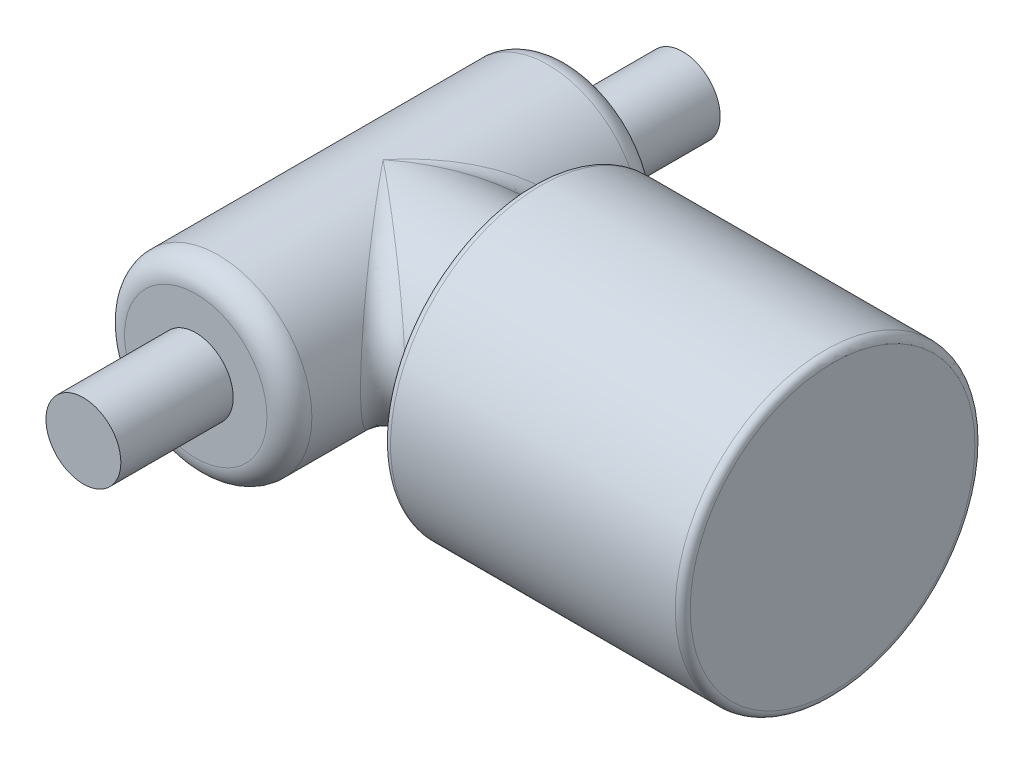
ISO-10303-21;
HEADER;
FILE_DESCRIPTION(('STEP AP214'),'2;1');
FILE_NAME('part.step','',(''),(''),'','','');
FILE_SCHEMA(('AUTOMOTIVE_DESIGN { 1 0 10303 214 1 1 1 1 }'));
ENDSEC;
DATA;
#1=APPLICATION_CONTEXT('core data for automotive mechanical design processes');
#2=APPLICATION_PROTOCOL_DEFINITION('international standard','automotive_design',2000,#1);
#3=PRODUCT_CONTEXT('',#1,'mechanical');
#4=PRODUCT('Part','Part','',(#3));
#5=PRODUCT_RELATED_PRODUCT_CATEGORY('part','',(#4));
#6=PRODUCT_DEFINITION_FORMATION('','',#4);
#7=PRODUCT_DEFINITION_CONTEXT('part definition',#1,'design');
#8=PRODUCT_DEFINITION('design','',#6,#7);
#9=PRODUCT_DEFINITION_SHAPE('','',#8);
#10=(LENGTH_UNIT() NAMED_UNIT(*) SI_UNIT(.MILLI.,.METRE.));
#11=(NAMED_UNIT(*) PLANE_ANGLE_UNIT() SI_UNIT($,.RADIAN.));
#12=(NAMED_UNIT(*) SI_UNIT($,.STERADIAN.) SOLID_ANGLE_UNIT());
#13=UNCERTAINTY_MEASURE_WITH_UNIT(LENGTH_MEASURE(1.E-05),#10,'distance_accuracy_value','');
#14=(GEOMETRIC_REPRESENTATION_CONTEXT(3) GLOBAL_UNCERTAINTY_ASSIGNED_CONTEXT((#13)) GLOBAL_UNIT_ASSIGNED_CONTEXT((#10,
#11,#12)) REPRESENTATION_CONTEXT('',''));
#15=CARTESIAN_POINT('',(0.,0.,0.));
#16=DIRECTION('',(0.,0.,1.));
#17=DIRECTION('',(1.,0.,0.));
#18=AXIS2_PLACEMENT_3D('',#15,#16,#17);
#19=CARTESIAN_POINT('',(55.3553390593274,0.,0.));
#20=DIRECTION('',(-1.,0.,0.));
#21=DIRECTION('',(0.,0.,1.));
#22=AXIS2_PLACEMENT_3D('',#19,#20,#21);
#23=CYLINDRICAL_SURFACE('',#22,12.5);
#24=CARTESIAN_POINT('',(20.,0.,0.));
#25=DIRECTION('',(1.,0.,0.));
#26=DIRECTION('',(0.,0.,-1.));
#27=AXIS2_PLACEMENT_3D('',#24,#25,#26);
#28=CIRCLE('',#27,12.5);
#29=CARTESIAN_POINT('',(20.,0.,-12.5));
#30=VERTEX_POINT('',#29);
#31=EDGE_CURVE('E78',#30,#30,#28,.F.);
#32=ORIENTED_EDGE('',*,*,#31,.T.);
#33=EDGE_LOOP('',(#32));
#34=FACE_BOUND('',#33,.T.);
#35=CARTESIAN_POINT('',(0.,0.,0.));
#36=DIRECTION('',(-0.627752451189782,0.,0.778413039475329));
#37=DIRECTION('',(-0.778413039475329,0.,-0.627752451189782));
#38=AXIS2_PLACEMENT_3D('',#35,#36,#37);
#39=ELLIPSE('',#38,19.9123077517399,12.5);
#40=CARTESIAN_POINT('',(0.,12.5,0.));
#41=VERTEX_POINT('',#40);
#42=CARTESIAN_POINT('',(0.,-12.5,0.));
#43=VERTEX_POINT('',#42);
#44=EDGE_CURVE('E66',#41,#43,#39,.F.);
#45=ORIENTED_EDGE('',*,*,#44,.T.);
#46=CARTESIAN_POINT('',(0.,0.,0.));
#47=DIRECTION('',(0.627752451189782,0.,0.778413039475329));
#48=DIRECTION('',(0.778413039475329,0.,-0.627752451189782));
#49=AXIS2_PLACEMENT_3D('',#46,#47,#48);
#50=ELLIPSE('',#49,19.9123077517399,12.5);
#51=EDGE_CURVE('E61',#43,#41,#50,.T.);
#52=ORIENTED_EDGE('',*,*,#51,.T.);
#53=EDGE_LOOP('',(#45,#52));
#54=FACE_BOUND('',#53,.T.);
#55=ADVANCED_FACE('F47',(#34,#54),#23,.T.);
#56=CARTESIAN_POINT('',(20.,0.,0.));
#57=DIRECTION('',(1.,0.,0.));
#58=DIRECTION('',(0.,0.,-1.));
#59=AXIS2_PLACEMENT_3D('',#56,#57,#58);
#60=CYLINDRICAL_SURFACE('',#59,20.);
#61=CARTESIAN_POINT('',(21.,0.,0.));
#62=DIRECTION('',(1.,0.,0.));
#63=DIRECTION('',(0.,0.,-1.));
#64=AXIS2_PLACEMENT_3D('',#61,#62,#63);
#65=CIRCLE('',#64,20.);
#66=CARTESIAN_POINT('',(21.,0.,-20.));
#67=VERTEX_POINT('',#66);
#68=EDGE_CURVE('E132',#67,#67,#65,.T.);
#69=ORIENTED_EDGE('',*,*,#68,.T.);
#70=EDGE_LOOP('',(#69));
#71=FACE_BOUND('',#70,.T.);
#72=CARTESIAN_POINT('',(59.,0.,0.));
#73=DIRECTION('',(1.,0.,0.));
#74=DIRECTION('',(0.,0.,-1.));
#75=AXIS2_PLACEMENT_3D('',#72,#73,#74);
#76=CIRCLE('',#75,20.);
#77=CARTESIAN_POINT('',(59.,0.,-20.));
#78=VERTEX_POINT('',#77);
#79=EDGE_CURVE('E133',#78,#78,#76,.F.);
#80=ORIENTED_EDGE('',*,*,#79,.T.);
#81=EDGE_LOOP('',(#80));
#82=FACE_BOUND('',#81,.T.);
#83=ADVANCED_FACE('F106',(#71,#82),#60,.T.);
#84=CARTESIAN_POINT('',(20.,0.,0.));
#85=DIRECTION('',(1.,0.,0.));
#86=DIRECTION('',(0.,0.,-1.));
#87=AXIS2_PLACEMENT_3D('',#84,#85,#86);
#88=PLANE('',#87);
#89=ORIENTED_EDGE('',*,*,#31,.F.);
#90=EDGE_LOOP('',(#89));
#91=FACE_BOUND('',#90,.T.);
#92=CARTESIAN_POINT('',(20.,0.,0.));
#93=DIRECTION('',(1.,0.,0.));
#94=DIRECTION('',(0.,0.,-1.));
#95=AXIS2_PLACEMENT_3D('',#92,#93,#94);
#96=CIRCLE('',#95,19.);
#97=CARTESIAN_POINT('',(20.,0.,-19.));
#98=VERTEX_POINT('',#97);
#99=EDGE_CURVE('E129',#98,#98,#96,.F.);
#100=ORIENTED_EDGE('',*,*,#99,.T.);
#101=EDGE_LOOP('',(#100));
#102=FACE_BOUND('',#101,.T.);
#103=ADVANCED_FACE('F108',(#91,#102),#88,.F.);
#104=CARTESIAN_POINT('',(60.,0.,0.));
#105=DIRECTION('',(1.,0.,0.));
#106=DIRECTION('',(0.,0.,-1.));
#107=AXIS2_PLACEMENT_3D('',#104,#105,#106);
#108=PLANE('',#107);
#109=CARTESIAN_POINT('',(60.,0.,0.));
#110=DIRECTION('',(1.,0.,0.));
#111=DIRECTION('',(0.,0.,-1.));
#112=AXIS2_PLACEMENT_3D('',#109,#110,#111);
#113=CIRCLE('',#112,19.);
#114=CARTESIAN_POINT('',(60.,0.,-19.));
#115=VERTEX_POINT('',#114);
#116=EDGE_CURVE('E135',#115,#115,#113,.T.);
#117=ORIENTED_EDGE('',*,*,#116,.T.);
#118=EDGE_LOOP('',(#117));
#119=FACE_BOUND('',#118,.T.);
#120=ADVANCED_FACE('F112',(#119),#108,.T.);
#121=CARTESIAN_POINT('',(21.,0.,0.));
#122=DIRECTION('',(1.,0.,0.));
#123=DIRECTION('',(0.,0.,-1.));
#124=AXIS2_PLACEMENT_3D('',#121,#122,#123);
#125=TOROIDAL_SURFACE('',#124,19.,1.);
#126=ORIENTED_EDGE('',*,*,#99,.F.);
#127=EDGE_LOOP('',(#126));
#128=FACE_BOUND('',#127,.T.);
#129=ORIENTED_EDGE('',*,*,#68,.F.);
#130=EDGE_LOOP('',(#129));
#131=FACE_BOUND('',#130,.T.);
#132=ADVANCED_FACE('F116',(#128,#131),#125,.T.);
#133=CARTESIAN_POINT('',(59.,0.,0.));
#134=DIRECTION('',(1.,0.,0.));
#135=DIRECTION('',(0.,0.,-1.));
#136=AXIS2_PLACEMENT_3D('',#133,#134,#135);
#137=TOROIDAL_SURFACE('',#136,19.,1.);
#138=ORIENTED_EDGE('',*,*,#79,.F.);
#139=EDGE_LOOP('',(#138));
#140=FACE_BOUND('',#139,.T.);
#141=ORIENTED_EDGE('',*,*,#116,.F.);
#142=EDGE_LOOP('',(#141));
#143=FACE_BOUND('',#142,.T.);
#144=ADVANCED_FACE('F97',(#140,#143),#137,.T.);
#145=CARTESIAN_POINT('',(0.,0.,25.));
#146=DIRECTION('',(0.,0.,-1.));
#147=DIRECTION('',(-1.,0.,0.));
#148=AXIS2_PLACEMENT_3D('',#145,#146,#147);
#149=CYLINDRICAL_SURFACE('',#148,12.5);
#150=CARTESIAN_POINT('',(0.,0.,-22.));
#151=DIRECTION('',(0.,0.,1.));
#152=DIRECTION('',(1.,0.,0.));
#153=AXIS2_PLACEMENT_3D('',#150,#151,#152);
#154=CIRCLE('',#153,12.5);
#155=CARTESIAN_POINT('',(12.5,0.,-22.));
#156=VERTEX_POINT('',#155);
#157=EDGE_CURVE('E187',#156,#156,#154,.T.);
#158=ORIENTED_EDGE('',*,*,#157,.T.);
#159=EDGE_LOOP('',(#158));
#160=FACE_BOUND('',#159,.T.);
#161=CARTESIAN_POINT('',(0.,0.,22.));
#162=DIRECTION('',(0.,0.,1.));
#163=DIRECTION('',(1.,0.,0.));
#164=AXIS2_PLACEMENT_3D('',#161,#162,#163);
#165=CIRCLE('',#164,12.5);
#166=CARTESIAN_POINT('',(12.5,0.,22.));
#167=VERTEX_POINT('',#166);
#168=EDGE_CURVE('E74',#167,#167,#165,.F.);
#169=ORIENTED_EDGE('',*,*,#168,.T.);
#170=EDGE_LOOP('',(#169));
#171=FACE_BOUND('',#170,.T.);
#172=CARTESIAN_POINT('',(0.,0.,0.));
#173=DIRECTION('',(-0.778413039475329,0.,0.627752451189782));
#174=DIRECTION('',(-0.627752451189782,0.,-0.778413039475329));
#175=AXIS2_PLACEMENT_3D('',#172,#173,#174);
#176=ELLIPSE('',#175,19.9123077517399,12.5);
#177=EDGE_CURVE('E69',#43,#41,#176,.T.);
#178=ORIENTED_EDGE('',*,*,#177,.T.);
#179=CARTESIAN_POINT('',(0.,0.,0.));
#180=DIRECTION('',(0.778413039475329,0.,0.627752451189782));
#181=DIRECTION('',(0.627752451189782,0.,-0.778413039475329));
#182=AXIS2_PLACEMENT_3D('',#179,#180,#181);
#183=ELLIPSE('',#182,19.9123077517399,12.5);
#184=EDGE_CURVE('E72',#41,#43,#183,.F.);
#185=ORIENTED_EDGE('',*,*,#184,.T.);
#186=EDGE_LOOP('',(#178,#185));
#187=FACE_BOUND('',#186,.T.);
#188=ADVANCED_FACE('F77',(#160,#171,#187),#149,.T.);
#189=CARTESIAN_POINT('',(0.,0.,25.));
#190=DIRECTION('',(0.,0.,1.));
#191=DIRECTION('',(1.,0.,0.));
#192=AXIS2_PLACEMENT_3D('',#189,#190,#191);
#193=PLANE('',#192);
#194=CARTESIAN_POINT('',(0.,0.,25.));
#195=DIRECTION('',(0.,0.,1.));
#196=DIRECTION('',(1.,0.,0.));
#197=AXIS2_PLACEMENT_3D('',#194,#195,#196);
#198=CIRCLE('',#197,5.);
#199=CARTESIAN_POINT('',(5.,0.,25.));
#200=VERTEX_POINT('',#199);
#201=EDGE_CURVE('E138',#200,#200,#198,.F.);
#202=ORIENTED_EDGE('',*,*,#201,.T.);
#203=EDGE_LOOP('',(#202));
#204=FACE_BOUND('',#203,.T.);
#205=CARTESIAN_POINT('',(0.,0.,25.));
#206=DIRECTION('',(0.,0.,1.));
#207=DIRECTION('',(1.,0.,0.));
#208=AXIS2_PLACEMENT_3D('',#205,#206,#207);
#209=CIRCLE('',#208,9.5);
#210=CARTESIAN_POINT('',(9.5,0.,25.));
#211=VERTEX_POINT('',#210);
#212=EDGE_CURVE('E55',#211,#211,#209,.T.);
#213=ORIENTED_EDGE('',*,*,#212,.T.);
#214=EDGE_LOOP('',(#213));
#215=FACE_BOUND('',#214,.T.);
#216=ADVANCED_FACE('F174',(#204,#215),#193,.T.);
#217=CARTESIAN_POINT('',(0.,0.,-25.));
#218=DIRECTION('',(0.,0.,1.));
#219=DIRECTION('',(1.,0.,0.));
#220=AXIS2_PLACEMENT_3D('',#217,#218,#219);
#221=PLANE('',#220);
#222=CARTESIAN_POINT('',(0.,0.,-25.));
#223=DIRECTION('',(0.,0.,1.));
#224=DIRECTION('',(1.,0.,0.));
#225=AXIS2_PLACEMENT_3D('',#222,#223,#224);
#226=CIRCLE('',#225,5.);
#227=CARTESIAN_POINT('',(5.,0.,-25.));
#228=VERTEX_POINT('',#227);
#229=EDGE_CURVE('E11',#228,#228,#226,.F.);
#230=ORIENTED_EDGE('',*,*,#229,.F.);
#231=EDGE_LOOP('',(#230));
#232=FACE_BOUND('',#231,.T.);
#233=CARTESIAN_POINT('',(0.,0.,-25.));
#234=DIRECTION('',(0.,0.,1.));
#235=DIRECTION('',(1.,0.,0.));
#236=AXIS2_PLACEMENT_3D('',#233,#234,#235);
#237=CIRCLE('',#236,9.5);
#238=CARTESIAN_POINT('',(9.5,0.,-25.));
#239=VERTEX_POINT('',#238);
#240=EDGE_CURVE('E185',#239,#239,#237,.F.);
#241=ORIENTED_EDGE('',*,*,#240,.T.);
#242=EDGE_LOOP('',(#241));
#243=FACE_BOUND('',#242,.T.);
#244=ADVANCED_FACE('F96',(#232,#243),#221,.F.);
#245=CARTESIAN_POINT('',(0.,12.5,0.));
#246=CARTESIAN_POINT('',(0.,12.5,0.));
#247=CARTESIAN_POINT('',(0.,12.5,0.));
#248=CARTESIAN_POINT('',(0.272334215839595,12.4999842968206,-0.337694427641132));
#249=CARTESIAN_POINT('',(0.305014070898885,12.5000250269501,-0.305014070898884));
#250=CARTESIAN_POINT('',(0.337694427641132,12.4999842968206,-0.272334215839595));
#251=CARTESIAN_POINT('',(0.544629138645477,12.4911003266135,-0.67534013192043));
#252=CARTESIAN_POINT('',(0.61020072603712,12.4889545114071,-0.61020072603712));
#253=CARTESIAN_POINT('',(0.67534013192043,12.4911003266135,-0.544629138645477));
#254=CARTESIAN_POINT('',(1.0886570294759,12.4554901480235,-1.34993471655014));
#255=CARTESIAN_POINT('',(1.21909433295838,12.4447999467103,-1.21909433295838));
#256=CARTESIAN_POINT('',(1.34993471655014,12.4554901480235,-1.0886570294759));
#257=CARTESIAN_POINT('',(1.36038994872527,12.428762451243,-1.68688353641934));
#258=CARTESIAN_POINT('',(1.52323317469561,12.4116511575331,-1.52323317469561));
#259=CARTESIAN_POINT('',(1.68688353641934,12.428762451243,-1.36038994872527));
#260=CARTESIAN_POINT('',(2.16917512103162,12.322286313524,-2.68977715007919));
#261=CARTESIAN_POINT('',(2.42782041062674,12.2796197617044,-2.42782041062674));
#262=CARTESIAN_POINT('',(2.68977715007919,12.322286313524,-2.16917512103162));
#263=CARTESIAN_POINT('',(2.70462924442139,12.2162454625646,-3.35374026308252));
#264=CARTESIAN_POINT('',(3.02582832373953,12.1477287520205,-3.02582832373953));
#265=CARTESIAN_POINT('',(3.35374026308252,12.2162454625646,-2.70462924442139));
#266=CARTESIAN_POINT('',(3.75694700559965,11.9342848497711,-4.65861428694357));
#267=CARTESIAN_POINT('',(4.1909095850711,11.8005554038436,-4.1909095850711));
#268=CARTESIAN_POINT('',(4.65861428694357,11.9342848497711,-3.75694700559965));
#269=CARTESIAN_POINT('',(4.27397182037635,11.7595669964088,-5.29972505726668));
#270=CARTESIAN_POINT('',(4.76139857712435,11.5847757217653,-4.76139857712435));
#271=CARTESIAN_POINT('',(5.29972505726668,11.7595669964088,-4.27397182037635));
#272=CARTESIAN_POINT('',(5.28056101396086,11.3426209678486,-6.54789565731145));
#273=CARTESIAN_POINT('',(5.85846904601324,11.0763606424388,-5.85846904601324));
#274=CARTESIAN_POINT('',(6.54789565731145,11.3426209678486,-5.28056101396086));
#275=CARTESIAN_POINT('',(5.77048810571742,11.1021618966254,-7.15540525108956));
#276=CARTESIAN_POINT('',(6.38835435875117,10.7829970865866,-6.38835435875117));
#277=CARTESIAN_POINT('',(7.15540525108956,11.1021618966254,-5.77048810571742));
#278=CARTESIAN_POINT('',(6.71424899934507,10.5572851717199,-8.32566875918792));
#279=CARTESIAN_POINT('',(7.3919514637015,10.1288557379361,-7.3919514637015));
#280=CARTESIAN_POINT('',(8.32566875918792,10.5572851717199,-6.71424899934507));
#281=CARTESIAN_POINT('',(7.1687352818597,10.2551469457419,-8.88923174950615));
#282=CARTESIAN_POINT('',(7.86876232357213,9.76716863776055,-7.86876232357213));
#283=CARTESIAN_POINT('',(8.88923174950615,10.2551469457419,-7.1687352818597));
#284=CARTESIAN_POINT('',(8.03355355695715,9.5915371206399,-9.96160641062674));
#285=CARTESIAN_POINT('',(8.75547572674122,8.98904500473894,-8.75547572674122));
#286=CARTESIAN_POINT('',(9.96160641062674,9.5915371206399,-8.03355355695715));
#287=CARTESIAN_POINT('',(8.44490707215241,9.2327559448887,-10.4716847694686));
#288=CARTESIAN_POINT('',(9.1681420770496,8.57162855209461,-9.1681420770496));
#289=CARTESIAN_POINT('',(10.4716847694686,9.2327559448887,-8.44490707215241));
#290=CARTESIAN_POINT('',(9.21598030276798,8.46169546206676,-11.4278155754327));
#291=CARTESIAN_POINT('',(9.91831594425704,7.69814423640428,-9.91831594425704));
#292=CARTESIAN_POINT('',(11.4278155754327,8.46169546206676,-9.21598030276798));
#293=CARTESIAN_POINT('',(9.5771531453111,8.05234645531936,-11.8756699001873));
#294=CARTESIAN_POINT('',(10.258091750161,7.24123543087261,-10.258091750161));
#295=CARTESIAN_POINT('',(11.8756699001873,8.05234645531936,-9.5771531453111));
#296=CARTESIAN_POINT('',(10.2414086495858,7.18659355257486,-12.699346725485));
#297=CARTESIAN_POINT('',(10.8582468500604,6.30756144455648,-10.8582468500604));
#298=CARTESIAN_POINT('',(12.699346725485,7.18659355257486,-10.2414086495858));
#299=CARTESIAN_POINT('',(10.5463726644067,6.73313170120446,-13.0775021038591));
#300=CARTESIAN_POINT('',(11.1202602951098,5.83040631171948,-11.1202602951098));
#301=CARTESIAN_POINT('',(13.0775021038591,6.73313170120446,-10.5463726644067));
#302=CARTESIAN_POINT('',(10.9587598589418,6.01887831616212,-13.5888622250904));
#303=CARTESIAN_POINT('',(11.4548866830344,5.11489091581528,-11.4548866830344));
#304=CARTESIAN_POINT('',(13.5888622250904,6.01887831616212,-10.9587598589418));
#305=CARTESIAN_POINT('',(11.0862477004806,5.7809666965891,-13.746947148603));
#306=CARTESIAN_POINT('',(11.5558590888405,4.87908096286154,-11.5558590888405));
#307=CARTESIAN_POINT('',(13.746947148603,5.7809666965891,-11.0862477004806));
#308=CARTESIAN_POINT('',(11.327819069823,5.29195572178776,-14.0464956465853));
#309=CARTESIAN_POINT('',(11.7417837536806,4.4045753382854,-11.7417837536806));
#310=CARTESIAN_POINT('',(14.0464956465853,5.29195572178776,-11.327819069823));
#311=CARTESIAN_POINT('',(11.4419085322106,5.04086227708294,-14.1879665799391));
#312=CARTESIAN_POINT('',(11.8264321598578,4.16603191587451,-11.8264321598578));
#313=CARTESIAN_POINT('',(14.1879665799391,5.04086227708294,-11.4419085322106));
#314=CARTESIAN_POINT('',(11.6509441950092,4.53620767662377,-14.4471708018133));
#315=CARTESIAN_POINT('',(11.9766913669589,3.69767067315385,-11.9766913669589));
#316=CARTESIAN_POINT('',(14.4471708018133,4.53620767662377,-11.6509441950092));
#317=CARTESIAN_POINT('',(11.7464614052599,4.28312028722009,-14.5656121425343));
#318=CARTESIAN_POINT('',(12.0426604292273,3.46802293343226,-12.0426604292273));
#319=CARTESIAN_POINT('',(14.5656121425343,4.28312028722009,-11.7464614052599));
#320=CARTESIAN_POINT('',(11.9221267263582,3.7665962231648,-14.7834371406965));
#321=CARTESIAN_POINT('',(12.160245110125,3.00996261327404,-12.160245110125));
#322=CARTESIAN_POINT('',(14.7834371406965,3.7665962231648,-11.9221267263582));
#323=CARTESIAN_POINT('',(12.0022822664305,3.5031646258396,-14.8828300103763));
#324=CARTESIAN_POINT('',(12.2115974233131,2.78193596693421,-12.2115974233131));
#325=CARTESIAN_POINT('',(14.8828300103763,3.5031646258396,-12.0022822664305));
#326=CARTESIAN_POINT('',(12.1437341657649,2.97525789363271,-15.058230365546));
#327=CARTESIAN_POINT('',(12.2995298245811,2.3350534589514,-12.2995298245811));
#328=CARTESIAN_POINT('',(15.058230365546,2.97525789363271,-12.1437341657649));
#329=CARTESIAN_POINT('',(12.2055193579358,2.7110454356778,-15.1348440038422));
#330=CARTESIAN_POINT('',(12.3362982001115,2.11652354511486,-12.3362982001115));
#331=CARTESIAN_POINT('',(15.1348440038422,2.7110454356778,-12.2055193579358));
#332=CARTESIAN_POINT('',(12.3121907568186,2.17586470577018,-15.2671165384586));
#333=CARTESIAN_POINT('',(12.398229483643,1.6821106384241,-12.398229483643));
#334=CARTESIAN_POINT('',(15.2671165384586,2.17586470577018,-12.3121907568186));
#335=CARTESIAN_POINT('',(12.3570777208226,1.90489673714524,-15.3227763738208));
#336=CARTESIAN_POINT('',(12.4232252611551,1.46676390778021,-12.4232252611551));
#337=CARTESIAN_POINT('',(15.3227763738208,1.90489673714524,-12.3570777208226));
#338=CARTESIAN_POINT('',(12.4284569672743,1.36271562385084,-15.4112866394194));
#339=CARTESIAN_POINT('',(12.4623338270064,1.0417833827475,-12.4623338270064));
#340=CARTESIAN_POINT('',(15.4112866394194,1.36271562385084,-12.4284569672743));
#341=CARTESIAN_POINT('',(12.4552373088023,1.0915785504443,-15.4444942629153));
#342=CARTESIAN_POINT('',(12.4765108762669,0.832661479402032,-12.4765108762669));
#343=CARTESIAN_POINT('',(15.4444942629153,1.0915785504443,-12.4552373088023));
#344=CARTESIAN_POINT('',(12.4910086669615,0.546960956846323,-15.488850747033));
#345=CARTESIAN_POINT('',(12.4953706774861,0.415399463715345,-12.4953706774861));
#346=CARTESIAN_POINT('',(15.488850747033,0.546960956846323,-12.4910086669615));
#347=CARTESIAN_POINT('',(12.5,0.273480478423161,-15.5));
#348=CARTESIAN_POINT('',(12.5,0.207849455004054,-12.5));
#349=CARTESIAN_POINT('',(15.5,0.273480478423161,-12.5));
#350=CARTESIAN_POINT('',(12.5,-0.273480478423161,-15.5));
#351=CARTESIAN_POINT('',(12.5,-0.207849455004054,-12.5));
#352=CARTESIAN_POINT('',(15.5,-0.273480478423161,-12.5));
#353=CARTESIAN_POINT('',(12.4910086669615,-0.546960956846323,-15.488850747033));
#354=CARTESIAN_POINT('',(12.4953706774861,-0.415399463715344,-12.4953706774861));
#355=CARTESIAN_POINT('',(15.488850747033,-0.546960956846323,-12.4910086669615));
#356=CARTESIAN_POINT('',(12.4552373088023,-1.0915785504443,-15.4444942629153));
#357=CARTESIAN_POINT('',(12.4765108762669,-0.832661479402032,-12.4765108762669));
#358=CARTESIAN_POINT('',(15.4444942629153,-1.0915785504443,-12.4552373088023));
#359=CARTESIAN_POINT('',(12.4284569672743,-1.36271562385084,-15.4112866394194));
#360=CARTESIAN_POINT('',(12.4623338270064,-1.0417833827475,-12.4623338270064));
#361=CARTESIAN_POINT('',(15.4112866394194,-1.36271562385084,-12.4284569672743));
#362=CARTESIAN_POINT('',(12.3570777208226,-1.90489673714524,-15.3227763738208));
#363=CARTESIAN_POINT('',(12.4232252611551,-1.46676390778021,-12.4232252611551));
#364=CARTESIAN_POINT('',(15.3227763738208,-1.90489673714524,-12.3570777208226));
#365=CARTESIAN_POINT('',(12.3121907568187,-2.17586470577018,-15.2671165384586));
#366=CARTESIAN_POINT('',(12.398229483643,-1.6821106384241,-12.398229483643));
#367=CARTESIAN_POINT('',(15.2671165384586,-2.17586470577018,-12.3121907568187));
#368=CARTESIAN_POINT('',(12.2055193579358,-2.71104543567779,-15.1348440038422));
#369=CARTESIAN_POINT('',(12.3362982001115,-2.11652354511485,-12.3362982001115));
#370=CARTESIAN_POINT('',(15.1348440038422,-2.71104543567779,-12.2055193579358));
#371=CARTESIAN_POINT('',(12.1437341657649,-2.9752578936327,-15.058230365546));
#372=CARTESIAN_POINT('',(12.2995298245811,-2.33505345895139,-12.2995298245811));
#373=CARTESIAN_POINT('',(15.058230365546,-2.9752578936327,-12.1437341657649));
#374=CARTESIAN_POINT('',(12.0022822664305,-3.50316462583959,-14.8828300103763));
#375=CARTESIAN_POINT('',(12.2115974233131,-2.7819359669342,-12.2115974233131));
#376=CARTESIAN_POINT('',(14.8828300103763,-3.50316462583959,-12.0022822664305));
#377=CARTESIAN_POINT('',(11.9221267263582,-3.7665962231648,-14.7834371406965));
#378=CARTESIAN_POINT('',(12.160245110125,-3.00996261327403,-12.160245110125));
#379=CARTESIAN_POINT('',(14.7834371406965,-3.7665962231648,-11.9221267263582));
#380=CARTESIAN_POINT('',(11.7464614052599,-4.28312028722009,-14.5656121425343));
#381=CARTESIAN_POINT('',(12.0426604292273,-3.46802293343226,-12.0426604292273));
#382=CARTESIAN_POINT('',(14.5656121425343,-4.28312028722009,-11.7464614052599));
#383=CARTESIAN_POINT('',(11.6509441950092,-4.53620767662377,-14.4471708018133));
#384=CARTESIAN_POINT('',(11.9766913669589,-3.69767067315385,-11.9766913669589));
#385=CARTESIAN_POINT('',(14.4471708018133,-4.53620767662377,-11.6509441950092));
#386=CARTESIAN_POINT('',(11.4419085322106,-5.04086227708294,-14.1879665799391));
#387=CARTESIAN_POINT('',(11.8264321598578,-4.16603191587452,-11.8264321598578));
#388=CARTESIAN_POINT('',(14.1879665799391,-5.04086227708294,-11.4419085322106));
#389=CARTESIAN_POINT('',(11.327819069823,-5.29195572178776,-14.0464956465853));
#390=CARTESIAN_POINT('',(11.7417837536806,-4.4045753382854,-11.7417837536806));
#391=CARTESIAN_POINT('',(14.0464956465853,-5.29195572178776,-11.327819069823));
#392=CARTESIAN_POINT('',(11.0862477004806,-5.7809666965891,-13.746947148603));
#393=CARTESIAN_POINT('',(11.5558590888405,-4.87908096286154,-11.5558590888405));
#394=CARTESIAN_POINT('',(13.746947148603,-5.7809666965891,-11.0862477004806));
#395=CARTESIAN_POINT('',(10.9587598589418,-6.01887831616211,-13.5888622250904));
#396=CARTESIAN_POINT('',(11.4548866830344,-5.11489091581527,-11.4548866830344));
#397=CARTESIAN_POINT('',(13.5888622250904,-6.01887831616211,-10.9587598589418));
#398=CARTESIAN_POINT('',(10.5463726644067,-6.73313170120445,-13.0775021038591));
#399=CARTESIAN_POINT('',(11.1202602951098,-5.83040631171948,-11.1202602951098));
#400=CARTESIAN_POINT('',(13.0775021038591,-6.73313170120445,-10.5463726644067));
#401=CARTESIAN_POINT('',(10.2414086495858,-7.18659355257485,-12.699346725485));
#402=CARTESIAN_POINT('',(10.8582468500604,-6.30756144455648,-10.8582468500604));
#403=CARTESIAN_POINT('',(12.699346725485,-7.18659355257485,-10.2414086495858));
#404=CARTESIAN_POINT('',(9.5771531453111,-8.05234645531935,-11.8756699001873));
#405=CARTESIAN_POINT('',(10.258091750161,-7.24123543087261,-10.258091750161));
#406=CARTESIAN_POINT('',(11.8756699001873,-8.05234645531935,-9.5771531453111));
#407=CARTESIAN_POINT('',(9.21598030276798,-8.46169546206676,-11.4278155754327));
#408=CARTESIAN_POINT('',(9.91831594425704,-7.69814423640428,-9.91831594425704));
#409=CARTESIAN_POINT('',(11.4278155754327,-8.46169546206676,-9.21598030276798));
#410=CARTESIAN_POINT('',(8.44490707215242,-9.23275594488869,-10.4716847694686));
#411=CARTESIAN_POINT('',(9.16814207704961,-8.5716285520946,-9.16814207704961));
#412=CARTESIAN_POINT('',(10.4716847694686,-9.23275594488869,-8.44490707215242));
#413=CARTESIAN_POINT('',(8.03355355695715,-9.5915371206399,-9.96160641062675));
#414=CARTESIAN_POINT('',(8.75547572674122,-8.98904500473893,-8.75547572674122));
#415=CARTESIAN_POINT('',(9.96160641062675,-9.5915371206399,-8.03355355695715));
#416=CARTESIAN_POINT('',(7.16873528185971,-10.2551469457419,-8.88923174950616));
#417=CARTESIAN_POINT('',(7.86876232357214,-9.76716863776054,-7.86876232357214));
#418=CARTESIAN_POINT('',(8.88923174950616,-10.2551469457419,-7.16873528185971));
#419=CARTESIAN_POINT('',(6.71424899934508,-10.5572851717199,-8.32566875918793));
#420=CARTESIAN_POINT('',(7.39195146370151,-10.1288557379361,-7.39195146370151));
#421=CARTESIAN_POINT('',(8.32566875918793,-10.5572851717199,-6.71424899934508));
#422=CARTESIAN_POINT('',(5.77048810571742,-11.1021618966254,-7.15540525108957));
#423=CARTESIAN_POINT('',(6.38835435875118,-10.7829970865866,-6.38835435875118));
#424=CARTESIAN_POINT('',(7.15540525108957,-11.1021618966254,-5.77048810571742));
#425=CARTESIAN_POINT('',(5.28056101396086,-11.3426209678486,-6.54789565731146));
#426=CARTESIAN_POINT('',(5.85846904601325,-11.0763606424388,-5.85846904601325));
#427=CARTESIAN_POINT('',(6.54789565731146,-11.3426209678486,-5.28056101396086));
#428=CARTESIAN_POINT('',(4.27397182037635,-11.7595669964088,-5.29972505726669));
#429=CARTESIAN_POINT('',(4.76139857712436,-11.5847757217653,-4.76139857712436));
#430=CARTESIAN_POINT('',(5.29972505726669,-11.7595669964088,-4.27397182037635));
#431=CARTESIAN_POINT('',(3.75694700559966,-11.9342848497711,-4.65861428694358));
#432=CARTESIAN_POINT('',(4.19090958507111,-11.8005554038436,-4.19090958507111));
#433=CARTESIAN_POINT('',(4.65861428694358,-11.9342848497711,-3.75694700559966));
#434=CARTESIAN_POINT('',(2.7046292444214,-12.2162454625646,-3.35374026308252));
#435=CARTESIAN_POINT('',(3.02582832373954,-12.1477287520205,-3.02582832373954));
#436=CARTESIAN_POINT('',(3.35374026308252,-12.2162454625646,-2.7046292444214));
#437=CARTESIAN_POINT('',(2.16917512103163,-12.322286313524,-2.6897771500792));
#438=CARTESIAN_POINT('',(2.42782041062674,-12.2796197617044,-2.42782041062674));
#439=CARTESIAN_POINT('',(2.6897771500792,-12.322286313524,-2.16917512103163));
#440=CARTESIAN_POINT('',(1.36038994872527,-12.428762451243,-1.68688353641935));
#441=CARTESIAN_POINT('',(1.52323317469561,-12.4116511575331,-1.52323317469561));
#442=CARTESIAN_POINT('',(1.68688353641935,-12.428762451243,-1.36038994872527));
#443=CARTESIAN_POINT('',(1.08865702947591,-12.4554901480235,-1.34993471655015));
#444=CARTESIAN_POINT('',(1.21909433295838,-12.4447999467103,-1.21909433295838));
#445=CARTESIAN_POINT('',(1.34993471655015,-12.4554901480235,-1.08865702947591));
#446=CARTESIAN_POINT('',(0.54462913864548,-12.4911003266135,-0.675340131920433));
#447=CARTESIAN_POINT('',(0.610200726037123,-12.4889545114071,-0.610200726037123));
#448=CARTESIAN_POINT('',(0.675340131920433,-12.4911003266135,-0.54462913864548));
#449=CARTESIAN_POINT('',(0.272334215839598,-12.4999842968206,-0.337694427641135));
#450=CARTESIAN_POINT('',(0.305014070898887,-12.5000250269501,-0.305014070898887));
#451=CARTESIAN_POINT('',(0.337694427641135,-12.4999842968206,-0.272334215839598));
#452=CARTESIAN_POINT('',(0.,-12.5,0.));
#453=CARTESIAN_POINT('',(0.,-12.5,0.));
#454=CARTESIAN_POINT('',(0.,-12.5,0.));
#455=(BOUNDED_SURFACE() B_SPLINE_SURFACE(3,2,((#245,#246,#247),(#248,#249,#250),(#251,#252,
#253),(#254,#255,#256),(#257,#258,#259),(#260,#261,#262),(#263,#264,#265),(#266,#267,#268),
(#269,#270,#271),(#272,#273,#274),(#275,#276,#277),(#278,#279,#280),(#281,#282,#283),(#284,#285,
#286),(#287,#288,#289),(#290,#291,#292),(#293,#294,#295),(#296,#297,#298),(#299,#300,#301),
(#302,#303,#304),(#305,#306,#307),(#308,#309,#310),(#311,#312,#313),(#314,#315,#316),(#317,#318,
#319),(#320,#321,#322),(#323,#324,#325),(#326,#327,#328),(#329,#330,#331),(#332,#333,#334),
(#335,#336,#337),(#338,#339,#340),(#341,#342,#343),(#344,#345,#346),(#347,#348,#349),(#350,#351,
#352),(#353,#354,#355),(#356,#357,#358),(#359,#360,#361),(#362,#363,#364),(#365,#366,#367),
(#368,#369,#370),(#371,#372,#373),(#374,#375,#376),(#377,#378,#379),(#380,#381,#382),(#383,#384,
#385),(#386,#387,#388),(#389,#390,#391),(#392,#393,#394),(#395,#396,#397),(#398,#399,#400),
(#401,#402,#403),(#404,#405,#406),(#407,#408,#409),(#410,#411,#412),(#413,#414,#415),(#416,#417,
#418),(#419,#420,#421),(#422,#423,#424),(#425,#426,#427),(#428,#429,#430),(#431,#432,#433),
(#434,#435,#436),(#437,#438,#439),(#440,#441,#442),(#443,#444,#445),(#446,#447,#448),(#449,#450,
#451),(#452,#453,#454)),.UNSPECIFIED.,.F.,.F.,.F.) B_SPLINE_SURFACE_WITH_KNOTS((4,2,2,2,2,2,2,2,
2,2,2,2,2,2,2,2,2,2,2,2,2,2,2,2,2,2,2,2,2,2,2,2,2,2,4),(3,3),(0.,1.43244845991781,
2.86501641949527,5.70491647725835,8.49718302079528,11.220663770523,13.8574559499711,
16.3940670854732,18.8226132095769,21.1420009158592,22.2515550825853,23.3606159226125,
24.4266445429283,25.4921563013007,26.5260662134398,27.5599297855178,28.5769321126465,
29.5939163505237,30.610900588401,31.6279029155297,32.6617664876076,33.6956763997468,
34.7611881581192,35.827216778435,36.9362776184622,38.0458317851883,40.3652194914706,
42.7937656155743,45.3303767510764,47.9671689305245,50.6906496802522,53.4829162237891,
56.3228162815522,57.7553842411297,59.1878327010475),(0.,1.),
.UNSPECIFIED.) GEOMETRIC_REPRESENTATION_ITEM() RATIONAL_B_SPLINE_SURFACE(((1.,1.,1.),(1.,
0.999999960865935,1.),(1.,0.99964392274264,1.),(1.,0.998220838485226,1.),(1.,0.997153733038909,
1.),(1.,0.992912441874251,1.),(1.,0.988698134543174,1.),(1.,0.977616683160221,1.),(1.,
0.970795220637255,1.),(1.,0.954789226710293,1.),(1.,0.945667047703301,1.),(1.,0.925487989826963,
1.),(1.,0.914501934744279,1.),(1.,0.891169826601919,1.),(1.,0.878891303129094,1.),(1.,
0.853707619024582,1.),(1.,0.840851439255054,1.),(1.,0.81538526421593,1.),(1.,0.802790177124734,
1.),(1.,0.784723218025256,1.),(1.,0.778962685168039,1.),(1.,0.767759899846262,1.),(1.,
0.762317507007581,1.),(1.,0.752114588403187,1.),(1.,0.747335799236677,1.),(1.,0.738380659152147,
1.),(1.,0.734204017266479,1.),(1.,0.726721604356059,1.),(1.,0.72339367827938,1.),(1.,
0.717585867143039,1.),(1.,0.715105944080684,1.),(1.,0.711136414411883,1.),(1.,0.709631316384635,
1.),(1.,0.707616508624132,1.),(1.,0.707106781186548,1.),(1.,0.707106781186548,1.),(1.,
0.707616508624132,1.),(1.,0.709631316384635,1.),(1.,0.711136414411883,1.),(1.,0.715105944080684,
1.),(1.,0.717585867143039,1.),(1.,0.72339367827938,1.),(1.,0.726721604356059,1.),(1.,
0.734204017266479,1.),(1.,0.738380659152147,1.),(1.,0.747335799236677,1.),(1.,0.752114588403187,
1.),(1.,0.762317507007581,1.),(1.,0.767759899846262,1.),(1.,0.778962685168039,1.),(1.,
0.784723218025256,1.),(1.,0.802790177124734,1.),(1.,0.81538526421593,1.),(1.,0.840851439255054,
1.),(1.,0.853707619024582,1.),(1.,0.878891303129093,1.),(1.,0.891169826601919,1.),(1.,
0.914501934744279,1.),(1.,0.925487989826963,1.),(1.,0.9456670477033,1.),(1.,0.954789226710293,
1.),(1.,0.970795220637255,1.),(1.,0.97761668316022,1.),(1.,0.988698134543174,1.),(1.,
0.992912441874251,1.),(1.,0.997153733038909,1.),(1.,0.998220838485226,1.),(1.,0.99964392274264,
1.),(1.,0.999999960865935,1.),(1.,1.,1.))) REPRESENTATION_ITEM('') SURFACE());
#456=ORIENTED_EDGE('',*,*,#184,.F.);
#457=ORIENTED_EDGE('',*,*,#51,.F.);
#458=EDGE_LOOP('',(#456,#457));
#459=FACE_BOUND('',#458,.T.);
#460=ADVANCED_FACE('F80',(#459),#455,.F.);
#461=CARTESIAN_POINT('',(0.,12.5,0.));
#462=CARTESIAN_POINT('',(0.,12.5,0.));
#463=CARTESIAN_POINT('',(0.,12.5,0.));
#464=CARTESIAN_POINT('',(0.337694427641134,12.4999842968206,0.272334215839597));
#465=CARTESIAN_POINT('',(0.305014070898887,12.5000250269501,0.305014070898887));
#466=CARTESIAN_POINT('',(0.272334215839597,12.4999842968206,0.337694427641134));
#467=CARTESIAN_POINT('',(0.675340131920433,12.4911003266135,0.544629138645479));
#468=CARTESIAN_POINT('',(0.610200726037123,12.4889545114071,0.610200726037123));
#469=CARTESIAN_POINT('',(0.544629138645479,12.4911003266135,0.675340131920433));
#470=CARTESIAN_POINT('',(1.34993471655015,12.4554901480235,1.08865702947591));
#471=CARTESIAN_POINT('',(1.21909433295838,12.4447999467103,1.21909433295838));
#472=CARTESIAN_POINT('',(1.08865702947591,12.4554901480235,1.34993471655015));
#473=CARTESIAN_POINT('',(1.68688353641934,12.428762451243,1.36038994872527));
#474=CARTESIAN_POINT('',(1.52323317469561,12.4116511575331,1.52323317469561));
#475=CARTESIAN_POINT('',(1.36038994872527,12.428762451243,1.68688353641934));
#476=CARTESIAN_POINT('',(2.6897771500792,12.322286313524,2.16917512103162));
#477=CARTESIAN_POINT('',(2.42782041062674,12.2796197617044,2.42782041062674));
#478=CARTESIAN_POINT('',(2.16917512103162,12.322286313524,2.6897771500792));
#479=CARTESIAN_POINT('',(3.35374026308252,12.2162454625646,2.7046292444214));
#480=CARTESIAN_POINT('',(3.02582832373953,12.1477287520205,3.02582832373953));
#481=CARTESIAN_POINT('',(2.7046292444214,12.2162454625646,3.35374026308252));
#482=CARTESIAN_POINT('',(4.65861428694358,11.9342848497711,3.75694700559966));
#483=CARTESIAN_POINT('',(4.1909095850711,11.8005554038436,4.1909095850711));
#484=CARTESIAN_POINT('',(3.75694700559966,11.9342848497711,4.65861428694358));
#485=CARTESIAN_POINT('',(5.29972505726668,11.7595669964088,4.27397182037635));
#486=CARTESIAN_POINT('',(4.76139857712436,11.5847757217653,4.76139857712436));
#487=CARTESIAN_POINT('',(4.27397182037635,11.7595669964088,5.29972505726668));
#488=CARTESIAN_POINT('',(6.54789565731145,11.3426209678486,5.28056101396086));
#489=CARTESIAN_POINT('',(5.85846904601324,11.0763606424388,5.85846904601324));
#490=CARTESIAN_POINT('',(5.28056101396086,11.3426209678486,6.54789565731145));
#491=CARTESIAN_POINT('',(7.15540525108956,11.1021618966254,5.77048810571742));
#492=CARTESIAN_POINT('',(6.38835435875117,10.7829970865866,6.38835435875117));
#493=CARTESIAN_POINT('',(5.77048810571742,11.1021618966254,7.15540525108956));
#494=CARTESIAN_POINT('',(8.32566875918792,10.5572851717199,6.71424899934507));
#495=CARTESIAN_POINT('',(7.3919514637015,10.1288557379361,7.3919514637015));
#496=CARTESIAN_POINT('',(6.71424899934507,10.5572851717199,8.32566875918792));
#497=CARTESIAN_POINT('',(8.88923174950615,10.2551469457419,7.16873528185971));
#498=CARTESIAN_POINT('',(7.86876232357214,9.76716863776054,7.86876232357214));
#499=CARTESIAN_POINT('',(7.16873528185971,10.2551469457419,8.88923174950615));
#500=CARTESIAN_POINT('',(9.96160641062675,9.5915371206399,8.03355355695715));
#501=CARTESIAN_POINT('',(8.75547572674122,8.98904500473893,8.75547572674122));
#502=CARTESIAN_POINT('',(8.03355355695715,9.5915371206399,9.96160641062675));
#503=CARTESIAN_POINT('',(10.4716847694686,9.23275594488869,8.44490707215242));
#504=CARTESIAN_POINT('',(9.16814207704961,8.5716285520946,9.16814207704961));
#505=CARTESIAN_POINT('',(8.44490707215242,9.23275594488869,10.4716847694686));
#506=CARTESIAN_POINT('',(11.4278155754327,8.46169546206676,9.21598030276798));
#507=CARTESIAN_POINT('',(9.91831594425704,7.69814423640428,9.91831594425704));
#508=CARTESIAN_POINT('',(9.21598030276798,8.46169546206676,11.4278155754327));
#509=CARTESIAN_POINT('',(11.8756699001873,8.05234645531936,9.5771531453111));
#510=CARTESIAN_POINT('',(10.258091750161,7.24123543087261,10.258091750161));
#511=CARTESIAN_POINT('',(9.5771531453111,8.05234645531936,11.8756699001873));
#512=CARTESIAN_POINT('',(12.699346725485,7.18659355257485,10.2414086495858));
#513=CARTESIAN_POINT('',(10.8582468500604,6.30756144455648,10.8582468500604));
#514=CARTESIAN_POINT('',(10.2414086495858,7.18659355257485,12.699346725485));
#515=CARTESIAN_POINT('',(13.0775021038591,6.73313170120445,10.5463726644067));
#516=CARTESIAN_POINT('',(11.1202602951098,5.83040631171948,11.1202602951098));
#517=CARTESIAN_POINT('',(10.5463726644067,6.73313170120445,13.0775021038591));
#518=CARTESIAN_POINT('',(13.5888622250904,6.01887831616211,10.9587598589418));
#519=CARTESIAN_POINT('',(11.4548866830344,5.11489091581527,11.4548866830344));
#520=CARTESIAN_POINT('',(10.9587598589418,6.01887831616211,13.5888622250904));
#521=CARTESIAN_POINT('',(13.746947148603,5.7809666965891,11.0862477004806));
#522=CARTESIAN_POINT('',(11.5558590888405,4.87908096286154,11.5558590888405));
#523=CARTESIAN_POINT('',(11.0862477004806,5.7809666965891,13.746947148603));
#524=CARTESIAN_POINT('',(14.0464956465853,5.29195572178776,11.327819069823));
#525=CARTESIAN_POINT('',(11.7417837536806,4.4045753382854,11.7417837536806));
#526=CARTESIAN_POINT('',(11.327819069823,5.29195572178776,14.0464956465853));
#527=CARTESIAN_POINT('',(14.1879665799391,5.04086227708294,11.4419085322106));
#528=CARTESIAN_POINT('',(11.8264321598578,4.16603191587452,11.8264321598578));
#529=CARTESIAN_POINT('',(11.4419085322106,5.04086227708294,14.1879665799391));
#530=CARTESIAN_POINT('',(14.4471708018133,4.53620767662377,11.6509441950092));
#531=CARTESIAN_POINT('',(11.9766913669589,3.69767067315386,11.9766913669589));
#532=CARTESIAN_POINT('',(11.6509441950092,4.53620767662377,14.4471708018133));
#533=CARTESIAN_POINT('',(14.5656121425343,4.28312028722009,11.7464614052599));
#534=CARTESIAN_POINT('',(12.0426604292273,3.46802293343226,12.0426604292273));
#535=CARTESIAN_POINT('',(11.7464614052599,4.28312028722009,14.5656121425343));
#536=CARTESIAN_POINT('',(14.7834371406965,3.7665962231648,11.9221267263582));
#537=CARTESIAN_POINT('',(12.160245110125,3.00996261327403,12.160245110125));
#538=CARTESIAN_POINT('',(11.9221267263582,3.7665962231648,14.7834371406965));
#539=CARTESIAN_POINT('',(14.8828300103763,3.50316462583959,12.0022822664305));
#540=CARTESIAN_POINT('',(12.2115974233131,2.7819359669342,12.2115974233131));
#541=CARTESIAN_POINT('',(12.0022822664305,3.50316462583959,14.8828300103763));
#542=CARTESIAN_POINT('',(15.058230365546,2.9752578936327,12.1437341657649));
#543=CARTESIAN_POINT('',(12.2995298245811,2.3350534589514,12.2995298245811));
#544=CARTESIAN_POINT('',(12.1437341657649,2.9752578936327,15.058230365546));
#545=CARTESIAN_POINT('',(15.1348440038422,2.7110454356778,12.2055193579358));
#546=CARTESIAN_POINT('',(12.3362982001115,2.11652354511485,12.3362982001115));
#547=CARTESIAN_POINT('',(12.2055193579358,2.7110454356778,15.1348440038422));
#548=CARTESIAN_POINT('',(15.2671165384586,2.17586470577018,12.3121907568187));
#549=CARTESIAN_POINT('',(12.398229483643,1.6821106384241,12.398229483643));
#550=CARTESIAN_POINT('',(12.3121907568187,2.17586470577018,15.2671165384586));
#551=CARTESIAN_POINT('',(15.3227763738208,1.90489673714524,12.3570777208226));
#552=CARTESIAN_POINT('',(12.4232252611551,1.46676390778021,12.4232252611551));
#553=CARTESIAN_POINT('',(12.3570777208226,1.90489673714524,15.3227763738208));
#554=CARTESIAN_POINT('',(15.4112866394194,1.36271562385084,12.4284569672743));
#555=CARTESIAN_POINT('',(12.4623338270064,1.0417833827475,12.4623338270064));
#556=CARTESIAN_POINT('',(12.4284569672743,1.36271562385084,15.4112866394194));
#557=CARTESIAN_POINT('',(15.4444942629153,1.0915785504443,12.4552373088023));
#558=CARTESIAN_POINT('',(12.4765108762669,0.832661479402034,12.4765108762669));
#559=CARTESIAN_POINT('',(12.4552373088023,1.0915785504443,15.4444942629153));
#560=CARTESIAN_POINT('',(15.488850747033,0.546960956846324,12.4910086669615));
#561=CARTESIAN_POINT('',(12.4953706774861,0.415399463715346,12.4953706774861));
#562=CARTESIAN_POINT('',(12.4910086669615,0.546960956846324,15.488850747033));
#563=CARTESIAN_POINT('',(15.5,0.273480478423163,12.5));
#564=CARTESIAN_POINT('',(12.5,0.207849455004055,12.5));
#565=CARTESIAN_POINT('',(12.5,0.273480478423163,15.5));
#566=CARTESIAN_POINT('',(15.5,-0.27348047842316,12.5));
#567=CARTESIAN_POINT('',(12.5,-0.207849455004053,12.5));
#568=CARTESIAN_POINT('',(12.5,-0.27348047842316,15.5));
#569=CARTESIAN_POINT('',(15.488850747033,-0.546960956846322,12.4910086669615));
#570=CARTESIAN_POINT('',(12.4953706774861,-0.415399463715344,12.4953706774861));
#571=CARTESIAN_POINT('',(12.4910086669615,-0.546960956846322,15.488850747033));
#572=CARTESIAN_POINT('',(15.4444942629153,-1.0915785504443,12.4552373088023));
#573=CARTESIAN_POINT('',(12.4765108762669,-0.832661479402032,12.4765108762669));
#574=CARTESIAN_POINT('',(12.4552373088023,-1.0915785504443,15.4444942629153));
#575=CARTESIAN_POINT('',(15.4112866394194,-1.36271562385084,12.4284569672743));
#576=CARTESIAN_POINT('',(12.4623338270064,-1.0417833827475,12.4623338270064));
#577=CARTESIAN_POINT('',(12.4284569672743,-1.36271562385084,15.4112866394194));
#578=CARTESIAN_POINT('',(15.3227763738208,-1.90489673714524,12.3570777208226));
#579=CARTESIAN_POINT('',(12.4232252611551,-1.46676390778021,12.4232252611551));
#580=CARTESIAN_POINT('',(12.3570777208226,-1.90489673714524,15.3227763738208));
#581=CARTESIAN_POINT('',(15.2671165384586,-2.17586470577018,12.3121907568187));
#582=CARTESIAN_POINT('',(12.398229483643,-1.6821106384241,12.398229483643));
#583=CARTESIAN_POINT('',(12.3121907568187,-2.17586470577018,15.2671165384586));
#584=CARTESIAN_POINT('',(15.1348440038422,-2.7110454356778,12.2055193579358));
#585=CARTESIAN_POINT('',(12.3362982001115,-2.11652354511485,12.3362982001115));
#586=CARTESIAN_POINT('',(12.2055193579358,-2.7110454356778,15.1348440038422));
#587=CARTESIAN_POINT('',(15.058230365546,-2.9752578936327,12.1437341657649));
#588=CARTESIAN_POINT('',(12.2995298245811,-2.33505345895139,12.2995298245811));
#589=CARTESIAN_POINT('',(12.1437341657649,-2.9752578936327,15.058230365546));
#590=CARTESIAN_POINT('',(14.8828300103763,-3.50316462583959,12.0022822664305));
#591=CARTESIAN_POINT('',(12.2115974233131,-2.7819359669342,12.2115974233131));
#592=CARTESIAN_POINT('',(12.0022822664305,-3.50316462583959,14.8828300103763));
#593=CARTESIAN_POINT('',(14.7834371406965,-3.7665962231648,11.9221267263582));
#594=CARTESIAN_POINT('',(12.160245110125,-3.00996261327403,12.160245110125));
#595=CARTESIAN_POINT('',(11.9221267263582,-3.7665962231648,14.7834371406965));
#596=CARTESIAN_POINT('',(14.5656121425343,-4.28312028722009,11.7464614052599));
#597=CARTESIAN_POINT('',(12.0426604292273,-3.46802293343226,12.0426604292273));
#598=CARTESIAN_POINT('',(11.7464614052599,-4.28312028722009,14.5656121425343));
#599=CARTESIAN_POINT('',(14.4471708018133,-4.53620767662377,11.6509441950092));
#600=CARTESIAN_POINT('',(11.9766913669589,-3.69767067315385,11.9766913669589));
#601=CARTESIAN_POINT('',(11.6509441950092,-4.53620767662377,14.4471708018133));
#602=CARTESIAN_POINT('',(14.1879665799391,-5.04086227708294,11.4419085322106));
#603=CARTESIAN_POINT('',(11.8264321598578,-4.16603191587452,11.8264321598578));
#604=CARTESIAN_POINT('',(11.4419085322106,-5.04086227708294,14.1879665799391));
#605=CARTESIAN_POINT('',(14.0464956465853,-5.29195572178776,11.327819069823));
#606=CARTESIAN_POINT('',(11.7417837536806,-4.4045753382854,11.7417837536806));
#607=CARTESIAN_POINT('',(11.327819069823,-5.29195572178776,14.0464956465853));
#608=CARTESIAN_POINT('',(13.746947148603,-5.7809666965891,11.0862477004806));
#609=CARTESIAN_POINT('',(11.5558590888405,-4.87908096286154,11.5558590888405));
#610=CARTESIAN_POINT('',(11.0862477004806,-5.7809666965891,13.746947148603));
#611=CARTESIAN_POINT('',(13.5888622250904,-6.01887831616211,10.9587598589418));
#612=CARTESIAN_POINT('',(11.4548866830344,-5.11489091581527,11.4548866830344));
#613=CARTESIAN_POINT('',(10.9587598589418,-6.01887831616211,13.5888622250904));
#614=CARTESIAN_POINT('',(13.0775021038591,-6.73313170120445,10.5463726644067));
#615=CARTESIAN_POINT('',(11.1202602951098,-5.83040631171948,11.1202602951098));
#616=CARTESIAN_POINT('',(10.5463726644067,-6.73313170120445,13.0775021038591));
#617=CARTESIAN_POINT('',(12.699346725485,-7.18659355257485,10.2414086495858));
#618=CARTESIAN_POINT('',(10.8582468500604,-6.30756144455648,10.8582468500604));
#619=CARTESIAN_POINT('',(10.2414086495858,-7.18659355257485,12.699346725485));
#620=CARTESIAN_POINT('',(11.8756699001873,-8.05234645531935,9.5771531453111));
#621=CARTESIAN_POINT('',(10.258091750161,-7.24123543087261,10.258091750161));
#622=CARTESIAN_POINT('',(9.5771531453111,-8.05234645531935,11.8756699001873));
#623=CARTESIAN_POINT('',(11.4278155754327,-8.46169546206676,9.21598030276799));
#624=CARTESIAN_POINT('',(9.91831594425704,-7.69814423640427,9.91831594425704));
#625=CARTESIAN_POINT('',(9.21598030276799,-8.46169546206676,11.4278155754327));
#626=CARTESIAN_POINT('',(10.4716847694686,-9.23275594488869,8.44490707215242));
#627=CARTESIAN_POINT('',(9.16814207704961,-8.5716285520946,9.16814207704961));
#628=CARTESIAN_POINT('',(8.44490707215242,-9.23275594488869,10.4716847694686));
#629=CARTESIAN_POINT('',(9.96160641062676,-9.59153712063989,8.03355355695716));
#630=CARTESIAN_POINT('',(8.75547572674123,-8.98904500473892,8.75547572674123));
#631=CARTESIAN_POINT('',(8.03355355695716,-9.59153712063989,9.96160641062676));
#632=CARTESIAN_POINT('',(8.88923174950616,-10.2551469457419,7.16873528185971));
#633=CARTESIAN_POINT('',(7.86876232357214,-9.76716863776054,7.86876232357214));
#634=CARTESIAN_POINT('',(7.16873528185971,-10.2551469457419,8.88923174950616));
#635=CARTESIAN_POINT('',(8.32566875918793,-10.5572851717199,6.71424899934508));
#636=CARTESIAN_POINT('',(7.39195146370151,-10.1288557379361,7.39195146370151));
#637=CARTESIAN_POINT('',(6.71424899934508,-10.5572851717199,8.32566875918793));
#638=CARTESIAN_POINT('',(7.15540525108957,-11.1021618966254,5.77048810571742));
#639=CARTESIAN_POINT('',(6.38835435875118,-10.7829970865866,6.38835435875118));
#640=CARTESIAN_POINT('',(5.77048810571742,-11.1021618966254,7.15540525108957));
#641=CARTESIAN_POINT('',(6.54789565731146,-11.3426209678486,5.28056101396086));
#642=CARTESIAN_POINT('',(5.85846904601325,-11.0763606424388,5.85846904601325));
#643=CARTESIAN_POINT('',(5.28056101396086,-11.3426209678486,6.54789565731146));
#644=CARTESIAN_POINT('',(5.29972505726669,-11.7595669964088,4.27397182037635));
#645=CARTESIAN_POINT('',(4.76139857712436,-11.5847757217653,4.76139857712436));
#646=CARTESIAN_POINT('',(4.27397182037635,-11.7595669964088,5.29972505726669));
#647=CARTESIAN_POINT('',(4.65861428694358,-11.9342848497711,3.75694700559965));
#648=CARTESIAN_POINT('',(4.1909095850711,-11.8005554038436,4.1909095850711));
#649=CARTESIAN_POINT('',(3.75694700559965,-11.9342848497711,4.65861428694358));
#650=CARTESIAN_POINT('',(3.35374026308252,-12.2162454625646,2.7046292444214));
#651=CARTESIAN_POINT('',(3.02582832373953,-12.1477287520205,3.02582832373953));
#652=CARTESIAN_POINT('',(2.7046292444214,-12.2162454625646,3.35374026308252));
#653=CARTESIAN_POINT('',(2.6897771500792,-12.322286313524,2.16917512103163));
#654=CARTESIAN_POINT('',(2.42782041062674,-12.2796197617044,2.42782041062674));
#655=CARTESIAN_POINT('',(2.16917512103163,-12.322286313524,2.6897771500792));
#656=CARTESIAN_POINT('',(1.68688353641934,-12.428762451243,1.36038994872527));
#657=CARTESIAN_POINT('',(1.52323317469561,-12.4116511575331,1.52323317469561));
#658=CARTESIAN_POINT('',(1.36038994872527,-12.428762451243,1.68688353641934));
#659=CARTESIAN_POINT('',(1.34993471655015,-12.4554901480235,1.08865702947591));
#660=CARTESIAN_POINT('',(1.21909433295838,-12.4447999467103,1.21909433295838));
#661=CARTESIAN_POINT('',(1.08865702947591,-12.4554901480235,1.34993471655015));
#662=CARTESIAN_POINT('',(0.675340131920434,-12.4911003266135,0.54462913864548));
#663=CARTESIAN_POINT('',(0.610200726037124,-12.4889545114071,0.610200726037124));
#664=CARTESIAN_POINT('',(0.54462913864548,-12.4911003266135,0.675340131920434));
#665=CARTESIAN_POINT('',(0.337694427641136,-12.4999842968206,0.272334215839599));
#666=CARTESIAN_POINT('',(0.305014070898889,-12.5000250269501,0.305014070898889));
#667=CARTESIAN_POINT('',(0.272334215839599,-12.4999842968206,0.337694427641136));
#668=CARTESIAN_POINT('',(0.,-12.5,0.));
#669=CARTESIAN_POINT('',(0.,-12.5,0.));
#670=CARTESIAN_POINT('',(0.,-12.5,0.));
#671=(BOUNDED_SURFACE() B_SPLINE_SURFACE(3,2,((#461,#462,#463),(#464,#465,#466),(#467,#468,
#469),(#470,#471,#472),(#473,#474,#475),(#476,#477,#478),(#479,#480,#481),(#482,#483,#484),
(#485,#486,#487),(#488,#489,#490),(#491,#492,#493),(#494,#495,#496),(#497,#498,#499),(#500,#501,
#502),(#503,#504,#505),(#506,#507,#508),(#509,#510,#511),(#512,#513,#514),(#515,#516,#517),
(#518,#519,#520),(#521,#522,#523),(#524,#525,#526),(#527,#528,#529),(#530,#531,#532),(#533,#534,
#535),(#536,#537,#538),(#539,#540,#541),(#542,#543,#544),(#545,#546,#547),(#548,#549,#550),
(#551,#552,#553),(#554,#555,#556),(#557,#558,#559),(#560,#561,#562),(#563,#564,#565),(#566,#567,
#568),(#569,#570,#571),(#572,#573,#574),(#575,#576,#577),(#578,#579,#580),(#581,#582,#583),
(#584,#585,#586),(#587,#588,#589),(#590,#591,#592),(#593,#594,#595),(#596,#597,#598),(#599,#600,
#601),(#602,#603,#604),(#605,#606,#607),(#608,#609,#610),(#611,#612,#613),(#614,#615,#616),
(#617,#618,#619),(#620,#621,#622),(#623,#624,#625),(#626,#627,#628),(#629,#630,#631),(#632,#633,
#634),(#635,#636,#637),(#638,#639,#640),(#641,#642,#643),(#644,#645,#646),(#647,#648,#649),
(#650,#651,#652),(#653,#654,#655),(#656,#657,#658),(#659,#660,#661),(#662,#663,#664),(#665,#666,
#667),(#668,#669,#670)),.UNSPECIFIED.,.F.,.F.,.F.) B_SPLINE_SURFACE_WITH_KNOTS((4,2,2,2,2,2,2,2,
2,2,2,2,2,2,2,2,2,2,2,2,2,2,2,2,2,2,2,2,2,2,2,2,2,2,4),(3,3),(0.,1.43244845991781,
2.86501641949528,5.70491647725836,8.49718302079529,11.220663770523,13.8574559499711,
16.3940670854732,18.8226132095769,21.1420009158592,22.2515550825853,23.3606159226125,
24.4266445429283,25.4921563013007,26.5260662134398,27.5599297855178,28.5769321126465,
29.5939163505237,30.610900588401,31.6279029155297,32.6617664876076,33.6956763997468,
34.7611881581192,35.827216778435,36.9362776184622,38.0458317851883,40.3652194914706,
42.7937656155743,45.3303767510764,47.9671689305245,50.6906496802522,53.4829162237891,
56.3228162815522,57.7553842411297,59.1878327010475),(0.,1.),
.UNSPECIFIED.) GEOMETRIC_REPRESENTATION_ITEM() RATIONAL_B_SPLINE_SURFACE(((1.,1.,1.),(1.,
0.999999960865935,1.),(1.,0.99964392274264,1.),(1.,0.998220838485226,1.),(1.,0.997153733038909,
1.),(1.,0.992912441874251,1.),(1.,0.988698134543174,1.),(1.,0.97761668316022,1.),(1.,
0.970795220637255,1.),(1.,0.954789226710293,1.),(1.,0.945667047703301,1.),(1.,0.925487989826963,
1.),(1.,0.914501934744279,1.),(1.,0.891169826601919,1.),(1.,0.878891303129094,1.),(1.,
0.853707619024582,1.),(1.,0.840851439255054,1.),(1.,0.81538526421593,1.),(1.,0.802790177124734,
1.),(1.,0.784723218025256,1.),(1.,0.778962685168039,1.),(1.,0.767759899846262,1.),(1.,
0.762317507007581,1.),(1.,0.752114588403187,1.),(1.,0.747335799236677,1.),(1.,0.738380659152147,
1.),(1.,0.734204017266479,1.),(1.,0.726721604356059,1.),(1.,0.72339367827938,1.),(1.,
0.717585867143039,1.),(1.,0.715105944080684,1.),(1.,0.711136414411883,1.),(1.,0.709631316384635,
1.),(1.,0.707616508624132,1.),(1.,0.707106781186548,1.),(1.,0.707106781186548,1.),(1.,
0.707616508624132,1.),(1.,0.709631316384635,1.),(1.,0.711136414411883,1.),(1.,0.715105944080684,
1.),(1.,0.717585867143039,1.),(1.,0.72339367827938,1.),(1.,0.726721604356059,1.),(1.,
0.734204017266479,1.),(1.,0.738380659152147,1.),(1.,0.747335799236677,1.),(1.,0.752114588403187,
1.),(1.,0.762317507007581,1.),(1.,0.767759899846262,1.),(1.,0.778962685168039,1.),(1.,
0.784723218025256,1.),(1.,0.802790177124734,1.),(1.,0.81538526421593,1.),(1.,0.840851439255054,
1.),(1.,0.853707619024582,1.),(1.,0.878891303129093,1.),(1.,0.891169826601919,1.),(1.,
0.914501934744279,1.),(1.,0.925487989826963,1.),(1.,0.945667047703301,1.),(1.,0.954789226710293,
1.),(1.,0.970795220637255,1.),(1.,0.97761668316022,1.),(1.,0.988698134543174,1.),(1.,
0.992912441874251,1.),(1.,0.997153733038909,1.),(1.,0.998220838485226,1.),(1.,0.99964392274264,
1.),(1.,0.999999960865935,1.),(1.,1.,1.))) REPRESENTATION_ITEM('') SURFACE());
#672=ORIENTED_EDGE('',*,*,#177,.F.);
#673=ORIENTED_EDGE('',*,*,#44,.F.);
#674=EDGE_LOOP('',(#672,#673));
#675=FACE_BOUND('',#674,.T.);
#676=ADVANCED_FACE('F67',(#675),#671,.F.);
#677=CARTESIAN_POINT('',(0.,0.,-22.));
#678=DIRECTION('',(0.,0.,1.));
#679=DIRECTION('',(1.,0.,0.));
#680=AXIS2_PLACEMENT_3D('',#677,#678,#679);
#681=TOROIDAL_SURFACE('',#680,9.5,3.);
#682=ORIENTED_EDGE('',*,*,#240,.F.);
#683=EDGE_LOOP('',(#682));
#684=FACE_BOUND('',#683,.T.);
#685=ORIENTED_EDGE('',*,*,#157,.F.);
#686=EDGE_LOOP('',(#685));
#687=FACE_BOUND('',#686,.T.);
#688=ADVANCED_FACE('F198',(#684,#687),#681,.T.);
#689=CARTESIAN_POINT('',(0.,0.,22.));
#690=DIRECTION('',(0.,0.,1.));
#691=DIRECTION('',(1.,0.,0.));
#692=AXIS2_PLACEMENT_3D('',#689,#690,#691);
#693=TOROIDAL_SURFACE('',#692,9.5,3.);
#694=ORIENTED_EDGE('',*,*,#168,.F.);
#695=EDGE_LOOP('',(#694));
#696=FACE_BOUND('',#695,.T.);
#697=ORIENTED_EDGE('',*,*,#212,.F.);
#698=EDGE_LOOP('',(#697));
#699=FACE_BOUND('',#698,.T.);
#700=ADVANCED_FACE('F49',(#696,#699),#693,.T.);
#701=CARTESIAN_POINT('',(0.,0.,-40.));
#702=DIRECTION('',(0.,0.,1.));
#703=DIRECTION('',(1.,0.,0.));
#704=AXIS2_PLACEMENT_3D('',#701,#702,#703);
#705=PLANE('',#704);
#706=CARTESIAN_POINT('',(0.,0.,-40.));
#707=DIRECTION('',(0.,0.,1.));
#708=DIRECTION('',(1.,0.,0.));
#709=AXIS2_PLACEMENT_3D('',#706,#707,#708);
#710=CIRCLE('',#709,5.);
#711=CARTESIAN_POINT('',(5.,0.,-40.));
#712=VERTEX_POINT('',#711);
#713=EDGE_CURVE('E151',#712,#712,#710,.T.);
#714=ORIENTED_EDGE('',*,*,#713,.F.);
#715=EDGE_LOOP('',(#714));
#716=FACE_BOUND('',#715,.T.);
#717=ADVANCED_FACE('F169',(#716),#705,.F.);
#718=CARTESIAN_POINT('',(0.,0.,40.));
#719=DIRECTION('',(0.,0.,-1.));
#720=DIRECTION('',(-1.,0.,0.));
#721=AXIS2_PLACEMENT_3D('',#718,#719,#720);
#722=CYLINDRICAL_SURFACE('',#721,5.);
#723=ORIENTED_EDGE('',*,*,#713,.T.);
#724=EDGE_LOOP('',(#723));
#725=FACE_BOUND('',#724,.T.);
#726=ORIENTED_EDGE('',*,*,#229,.T.);
#727=EDGE_LOOP('',(#726));
#728=FACE_BOUND('',#727,.T.);
#729=ADVANCED_FACE('F161',(#725,#728),#722,.T.);
#730=ORIENTED_EDGE('',*,*,#201,.F.);
#731=EDGE_LOOP('',(#730));
#732=FACE_BOUND('',#731,.T.);
#733=CARTESIAN_POINT('',(0.,0.,40.));
#734=DIRECTION('',(0.,0.,1.));
#735=DIRECTION('',(1.,0.,0.));
#736=AXIS2_PLACEMENT_3D('',#733,#734,#735);
#737=CIRCLE('',#736,5.);
#738=CARTESIAN_POINT('',(5.,0.,40.));
#739=VERTEX_POINT('',#738);
#740=EDGE_CURVE('E150',#739,#739,#737,.T.);
#741=ORIENTED_EDGE('',*,*,#740,.F.);
#742=EDGE_LOOP('',(#741));
#743=FACE_BOUND('',#742,.T.);
#744=ADVANCED_FACE('F159',(#732,#743),#722,.T.);
#745=CARTESIAN_POINT('',(0.,0.,40.));
#746=DIRECTION('',(0.,0.,1.));
#747=DIRECTION('',(1.,0.,0.));
#748=AXIS2_PLACEMENT_3D('',#745,#746,#747);
#749=PLANE('',#748);
#750=ORIENTED_EDGE('',*,*,#740,.T.);
#751=EDGE_LOOP('',(#750));
#752=FACE_BOUND('',#751,.T.);
#753=ADVANCED_FACE('F157',(#752),#749,.T.);
#754=CLOSED_SHELL('',(#55,#83,#103,#120,#132,#144,#188,#216,#244,#460,#676,#688,#700,#717,#729,
#744,#753));
#755=MANIFOLD_SOLID_BREP('B2',#754);
#756=ADVANCED_BREP_SHAPE_REPRESENTATION('',(#18,#755),#14);
#757=SHAPE_DEFINITION_REPRESENTATION(#9,#756);
ENDSEC;
END-ISO-10303-21;
